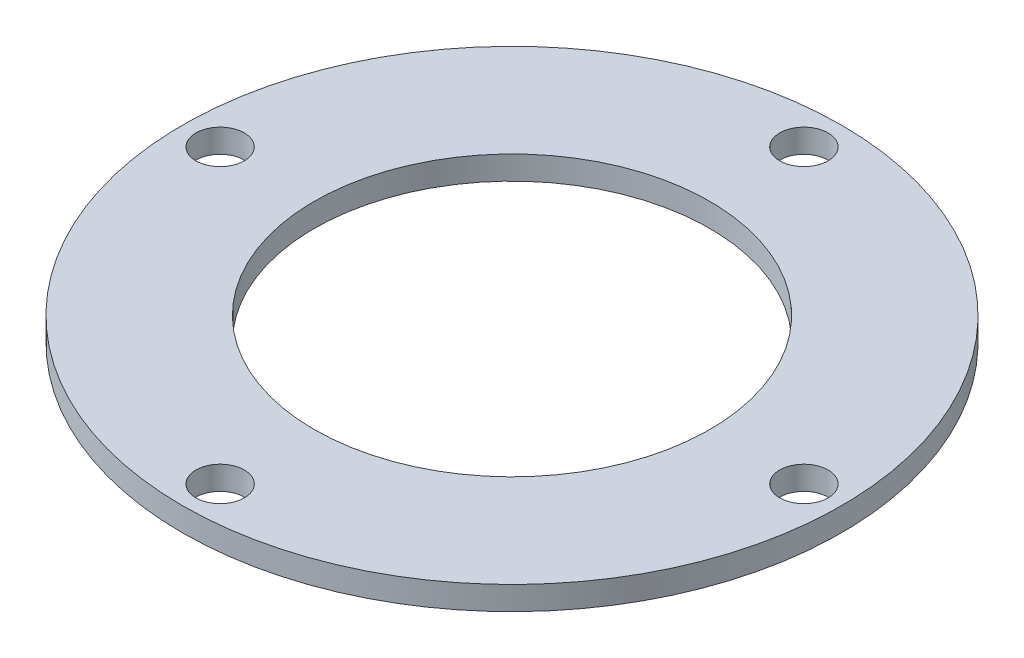
ISO-10303-21;
HEADER;
FILE_DESCRIPTION(('STEP AP214'),'2;1');
FILE_NAME('part.step','',(''),(''),'','','');
FILE_SCHEMA(('AUTOMOTIVE_DESIGN { 1 0 10303 214 1 1 1 1 }'));
ENDSEC;
DATA;
#1=APPLICATION_CONTEXT('core data for automotive mechanical design processes');
#2=APPLICATION_PROTOCOL_DEFINITION('international standard','automotive_design',2000,#1);
#3=PRODUCT_CONTEXT('',#1,'mechanical');
#4=PRODUCT('Part','Part','',(#3));
#5=PRODUCT_RELATED_PRODUCT_CATEGORY('part','',(#4));
#6=PRODUCT_DEFINITION_FORMATION('','',#4);
#7=PRODUCT_DEFINITION_CONTEXT('part definition',#1,'design');
#8=PRODUCT_DEFINITION('design','',#6,#7);
#9=PRODUCT_DEFINITION_SHAPE('','',#8);
#10=(LENGTH_UNIT() NAMED_UNIT(*) SI_UNIT(.MILLI.,.METRE.));
#11=(NAMED_UNIT(*) PLANE_ANGLE_UNIT() SI_UNIT($,.RADIAN.));
#12=(NAMED_UNIT(*) SI_UNIT($,.STERADIAN.) SOLID_ANGLE_UNIT());
#13=UNCERTAINTY_MEASURE_WITH_UNIT(LENGTH_MEASURE(1.E-05),#10,'distance_accuracy_value','');
#14=(GEOMETRIC_REPRESENTATION_CONTEXT(3) GLOBAL_UNCERTAINTY_ASSIGNED_CONTEXT((#13)) GLOBAL_UNIT_ASSIGNED_CONTEXT((#10,
#11,#12)) REPRESENTATION_CONTEXT('',''));
#15=CARTESIAN_POINT('',(0.,0.,0.));
#16=DIRECTION('',(0.,0.,1.));
#17=DIRECTION('',(1.,0.,0.));
#18=AXIS2_PLACEMENT_3D('',#15,#16,#17);
#19=CARTESIAN_POINT('',(0.,3.175,0.));
#20=DIRECTION('',(0.,1.,0.));
#21=DIRECTION('',(0.,0.,1.));
#22=AXIS2_PLACEMENT_3D('',#19,#20,#21);
#23=PLANE('',#22);
#24=CARTESIAN_POINT('',(0.,3.175,39.37));
#25=DIRECTION('',(0.,1.,0.));
#26=DIRECTION('',(0.,0.,1.));
#27=AXIS2_PLACEMENT_3D('',#24,#25,#26);
#28=CIRCLE('',#27,3.2639);
#29=CARTESIAN_POINT('',(0.,3.175,42.6339));
#30=VERTEX_POINT('',#29);
#31=EDGE_CURVE('E59',#30,#30,#28,.T.);
#32=ORIENTED_EDGE('',*,*,#31,.F.);
#33=EDGE_LOOP('',(#32));
#34=FACE_BOUND('',#33,.T.);
#35=CARTESIAN_POINT('',(0.,3.175,-39.37));
#36=DIRECTION('',(0.,1.,0.));
#37=DIRECTION('',(0.,0.,1.));
#38=AXIS2_PLACEMENT_3D('',#35,#36,#37);
#39=CIRCLE('',#38,3.2639);
#40=CARTESIAN_POINT('',(0.,3.175,-36.1061));
#41=VERTEX_POINT('',#40);
#42=EDGE_CURVE('E47',#41,#41,#39,.T.);
#43=ORIENTED_EDGE('',*,*,#42,.F.);
#44=EDGE_LOOP('',(#43));
#45=FACE_BOUND('',#44,.T.);
#46=CARTESIAN_POINT('',(0.,3.175,0.));
#47=DIRECTION('',(0.,1.,0.));
#48=DIRECTION('',(0.,0.,1.));
#49=AXIS2_PLACEMENT_3D('',#46,#47,#48);
#50=CIRCLE('',#49,44.45);
#51=CARTESIAN_POINT('',(0.,3.175,44.45));
#52=VERTEX_POINT('',#51);
#53=EDGE_CURVE('E10',#52,#52,#50,.T.);
#54=ORIENTED_EDGE('',*,*,#53,.T.);
#55=EDGE_LOOP('',(#54));
#56=FACE_BOUND('',#55,.T.);
#57=CARTESIAN_POINT('',(0.,3.175,0.));
#58=DIRECTION('',(0.,1.,0.));
#59=DIRECTION('',(0.,0.,1.));
#60=AXIS2_PLACEMENT_3D('',#57,#58,#59);
#61=CIRCLE('',#60,26.67);
#62=CARTESIAN_POINT('',(0.,3.175,26.67));
#63=VERTEX_POINT('',#62);
#64=EDGE_CURVE('E42',#63,#63,#61,.T.);
#65=ORIENTED_EDGE('',*,*,#64,.F.);
#66=EDGE_LOOP('',(#65));
#67=FACE_BOUND('',#66,.T.);
#68=CARTESIAN_POINT('',(39.37,3.175,0.));
#69=DIRECTION('',(0.,1.,0.));
#70=DIRECTION('',(0.,0.,1.));
#71=AXIS2_PLACEMENT_3D('',#68,#69,#70);
#72=CIRCLE('',#71,3.26390000000011);
#73=CARTESIAN_POINT('',(39.37,3.175,3.26390000000011));
#74=VERTEX_POINT('',#73);
#75=EDGE_CURVE('E53',#74,#74,#72,.T.);
#76=ORIENTED_EDGE('',*,*,#75,.F.);
#77=EDGE_LOOP('',(#76));
#78=FACE_BOUND('',#77,.T.);
#79=CARTESIAN_POINT('',(-39.37,3.175,0.));
#80=DIRECTION('',(0.,1.,0.));
#81=DIRECTION('',(0.,0.,1.));
#82=AXIS2_PLACEMENT_3D('',#79,#80,#81);
#83=CIRCLE('',#82,3.2639);
#84=CARTESIAN_POINT('',(-39.37,3.175,3.26390000000001));
#85=VERTEX_POINT('',#84);
#86=EDGE_CURVE('E65',#85,#85,#83,.T.);
#87=ORIENTED_EDGE('',*,*,#86,.F.);
#88=EDGE_LOOP('',(#87));
#89=FACE_BOUND('',#88,.T.);
#90=ADVANCED_FACE('F31',(#34,#45,#56,#67,#78,#89),#23,.T.);
#91=CARTESIAN_POINT('',(0.,0.,0.));
#92=DIRECTION('',(0.,1.,0.));
#93=DIRECTION('',(0.,0.,1.));
#94=AXIS2_PLACEMENT_3D('',#91,#92,#93);
#95=PLANE('',#94);
#96=CARTESIAN_POINT('',(0.,0.,0.));
#97=DIRECTION('',(0.,1.,0.));
#98=DIRECTION('',(0.,0.,1.));
#99=AXIS2_PLACEMENT_3D('',#96,#97,#98);
#100=CIRCLE('',#99,44.45);
#101=CARTESIAN_POINT('',(0.,0.,44.45));
#102=VERTEX_POINT('',#101);
#103=EDGE_CURVE('E35',#102,#102,#100,.T.);
#104=ORIENTED_EDGE('',*,*,#103,.F.);
#105=EDGE_LOOP('',(#104));
#106=FACE_BOUND('',#105,.T.);
#107=CARTESIAN_POINT('',(0.,0.,0.));
#108=DIRECTION('',(0.,1.,0.));
#109=DIRECTION('',(0.,0.,1.));
#110=AXIS2_PLACEMENT_3D('',#107,#108,#109);
#111=CIRCLE('',#110,26.67);
#112=CARTESIAN_POINT('',(0.,0.,26.67));
#113=VERTEX_POINT('',#112);
#114=EDGE_CURVE('E44',#113,#113,#111,.T.);
#115=ORIENTED_EDGE('',*,*,#114,.T.);
#116=EDGE_LOOP('',(#115));
#117=FACE_BOUND('',#116,.T.);
#118=CARTESIAN_POINT('',(0.,0.,-39.37));
#119=DIRECTION('',(0.,1.,0.));
#120=DIRECTION('',(0.,0.,1.));
#121=AXIS2_PLACEMENT_3D('',#118,#119,#120);
#122=CIRCLE('',#121,3.2639);
#123=CARTESIAN_POINT('',(0.,0.,-36.1061));
#124=VERTEX_POINT('',#123);
#125=EDGE_CURVE('E50',#124,#124,#122,.T.);
#126=ORIENTED_EDGE('',*,*,#125,.T.);
#127=EDGE_LOOP('',(#126));
#128=FACE_BOUND('',#127,.T.);
#129=CARTESIAN_POINT('',(39.37,0.,0.));
#130=DIRECTION('',(0.,1.,0.));
#131=DIRECTION('',(0.,0.,1.));
#132=AXIS2_PLACEMENT_3D('',#129,#130,#131);
#133=CIRCLE('',#132,3.26390000000011);
#134=CARTESIAN_POINT('',(39.37,0.,3.26390000000011));
#135=VERTEX_POINT('',#134);
#136=EDGE_CURVE('E56',#135,#135,#133,.T.);
#137=ORIENTED_EDGE('',*,*,#136,.T.);
#138=EDGE_LOOP('',(#137));
#139=FACE_BOUND('',#138,.T.);
#140=CARTESIAN_POINT('',(0.,0.,39.37));
#141=DIRECTION('',(0.,1.,0.));
#142=DIRECTION('',(0.,0.,1.));
#143=AXIS2_PLACEMENT_3D('',#140,#141,#142);
#144=CIRCLE('',#143,3.2639);
#145=CARTESIAN_POINT('',(0.,0.,42.6339));
#146=VERTEX_POINT('',#145);
#147=EDGE_CURVE('E62',#146,#146,#144,.T.);
#148=ORIENTED_EDGE('',*,*,#147,.T.);
#149=EDGE_LOOP('',(#148));
#150=FACE_BOUND('',#149,.T.);
#151=CARTESIAN_POINT('',(-39.37,0.,0.));
#152=DIRECTION('',(0.,1.,0.));
#153=DIRECTION('',(0.,0.,1.));
#154=AXIS2_PLACEMENT_3D('',#151,#152,#153);
#155=CIRCLE('',#154,3.2639);
#156=CARTESIAN_POINT('',(-39.37,0.,3.26390000000001));
#157=VERTEX_POINT('',#156);
#158=EDGE_CURVE('E68',#157,#157,#155,.T.);
#159=ORIENTED_EDGE('',*,*,#158,.T.);
#160=EDGE_LOOP('',(#159));
#161=FACE_BOUND('',#160,.T.);
#162=ADVANCED_FACE('F78',(#106,#117,#128,#139,#150,#161),#95,.F.);
#163=CARTESIAN_POINT('',(0.,3.175,0.));
#164=DIRECTION('',(0.,-1.,0.));
#165=DIRECTION('',(0.,0.,-1.));
#166=AXIS2_PLACEMENT_3D('',#163,#164,#165);
#167=CYLINDRICAL_SURFACE('',#166,44.45);
#168=ORIENTED_EDGE('',*,*,#53,.F.);
#169=EDGE_LOOP('',(#168));
#170=FACE_BOUND('',#169,.T.);
#171=ORIENTED_EDGE('',*,*,#103,.T.);
#172=EDGE_LOOP('',(#171));
#173=FACE_BOUND('',#172,.T.);
#174=ADVANCED_FACE('F33',(#170,#173),#167,.T.);
#175=CARTESIAN_POINT('',(0.,3.175,0.));
#176=DIRECTION('',(0.,-1.,0.));
#177=DIRECTION('',(0.,0.,-1.));
#178=AXIS2_PLACEMENT_3D('',#175,#176,#177);
#179=CYLINDRICAL_SURFACE('',#178,26.67);
#180=ORIENTED_EDGE('',*,*,#64,.T.);
#181=EDGE_LOOP('',(#180));
#182=FACE_BOUND('',#181,.T.);
#183=ORIENTED_EDGE('',*,*,#114,.F.);
#184=EDGE_LOOP('',(#183));
#185=FACE_BOUND('',#184,.T.);
#186=ADVANCED_FACE('F88',(#182,#185),#179,.F.);
#187=CARTESIAN_POINT('',(0.,3.175,-39.37));
#188=DIRECTION('',(0.,-1.,0.));
#189=DIRECTION('',(0.,0.,-1.));
#190=AXIS2_PLACEMENT_3D('',#187,#188,#189);
#191=CYLINDRICAL_SURFACE('',#190,3.2639);
#192=ORIENTED_EDGE('',*,*,#42,.T.);
#193=EDGE_LOOP('',(#192));
#194=FACE_BOUND('',#193,.T.);
#195=ORIENTED_EDGE('',*,*,#125,.F.);
#196=EDGE_LOOP('',(#195));
#197=FACE_BOUND('',#196,.T.);
#198=ADVANCED_FACE('F91',(#194,#197),#191,.F.);
#199=CARTESIAN_POINT('',(39.37,3.175,0.));
#200=DIRECTION('',(0.,-1.,0.));
#201=DIRECTION('',(0.,0.,-1.));
#202=AXIS2_PLACEMENT_3D('',#199,#200,#201);
#203=CYLINDRICAL_SURFACE('',#202,3.26390000000011);
#204=ORIENTED_EDGE('',*,*,#75,.T.);
#205=EDGE_LOOP('',(#204));
#206=FACE_BOUND('',#205,.T.);
#207=ORIENTED_EDGE('',*,*,#136,.F.);
#208=EDGE_LOOP('',(#207));
#209=FACE_BOUND('',#208,.T.);
#210=ADVANCED_FACE('F95',(#206,#209),#203,.F.);
#211=CARTESIAN_POINT('',(0.,3.175,39.37));
#212=DIRECTION('',(0.,-1.,0.));
#213=DIRECTION('',(0.,0.,-1.));
#214=AXIS2_PLACEMENT_3D('',#211,#212,#213);
#215=CYLINDRICAL_SURFACE('',#214,3.2639);
#216=ORIENTED_EDGE('',*,*,#31,.T.);
#217=EDGE_LOOP('',(#216));
#218=FACE_BOUND('',#217,.T.);
#219=ORIENTED_EDGE('',*,*,#147,.F.);
#220=EDGE_LOOP('',(#219));
#221=FACE_BOUND('',#220,.T.);
#222=ADVANCED_FACE('F99',(#218,#221),#215,.F.);
#223=CARTESIAN_POINT('',(-39.37,3.175,0.));
#224=DIRECTION('',(0.,-1.,0.));
#225=DIRECTION('',(0.,0.,-1.));
#226=AXIS2_PLACEMENT_3D('',#223,#224,#225);
#227=CYLINDRICAL_SURFACE('',#226,3.2639);
#228=ORIENTED_EDGE('',*,*,#86,.T.);
#229=EDGE_LOOP('',(#228));
#230=FACE_BOUND('',#229,.T.);
#231=ORIENTED_EDGE('',*,*,#158,.F.);
#232=EDGE_LOOP('',(#231));
#233=FACE_BOUND('',#232,.T.);
#234=ADVANCED_FACE('F74',(#230,#233),#227,.F.);
#235=CLOSED_SHELL('',(#90,#162,#174,#186,#198,#210,#222,#234));
#236=MANIFOLD_SOLID_BREP('B2',#235);
#237=ADVANCED_BREP_SHAPE_REPRESENTATION('',(#18,#236),#14);
#238=SHAPE_DEFINITION_REPRESENTATION(#9,#237);
ENDSEC;
END-ISO-10303-21;
